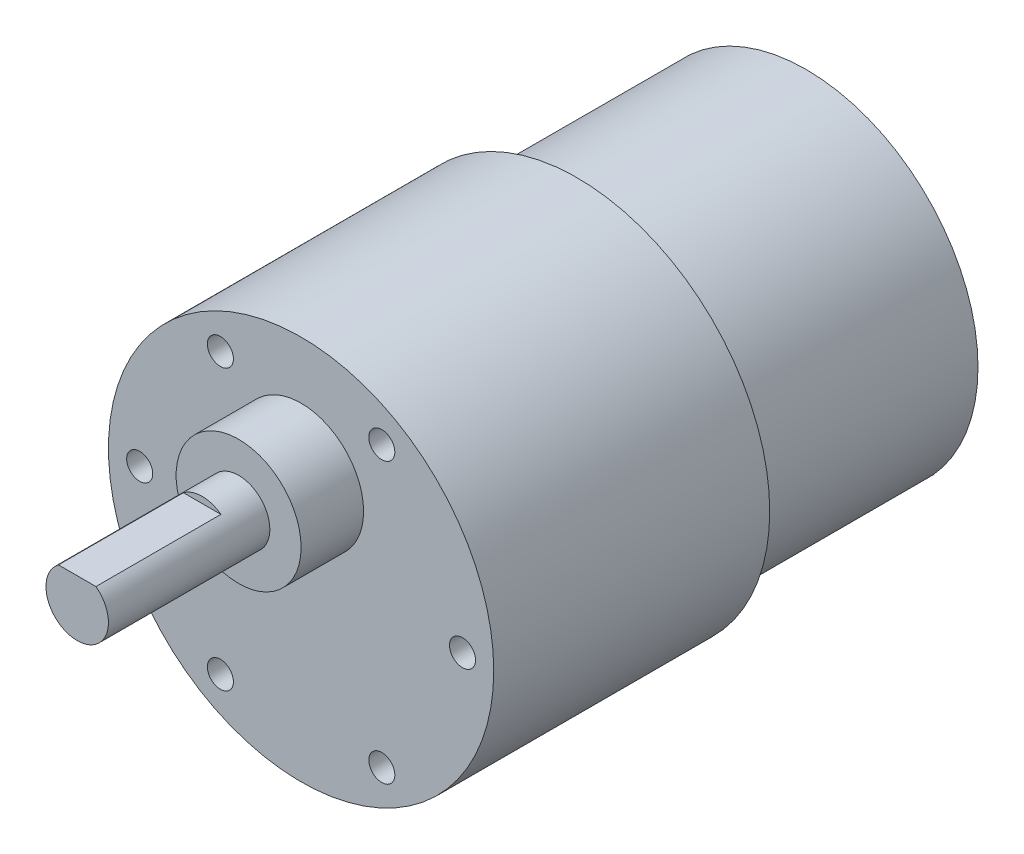
ISO-10303-21;
HEADER;
FILE_DESCRIPTION(('STEP AP214'),'2;1');
FILE_NAME('part.step','',(''),(''),'','','');
FILE_SCHEMA(('AUTOMOTIVE_DESIGN { 1 0 10303 214 1 1 1 1 }'));
ENDSEC;
DATA;
#1=APPLICATION_CONTEXT('core data for automotive mechanical design processes');
#2=APPLICATION_PROTOCOL_DEFINITION('international standard','automotive_design',2000,#1);
#3=PRODUCT_CONTEXT('',#1,'mechanical');
#4=PRODUCT('Part','Part','',(#3));
#5=PRODUCT_RELATED_PRODUCT_CATEGORY('part','',(#4));
#6=PRODUCT_DEFINITION_FORMATION('','',#4);
#7=PRODUCT_DEFINITION_CONTEXT('part definition',#1,'design');
#8=PRODUCT_DEFINITION('design','',#6,#7);
#9=PRODUCT_DEFINITION_SHAPE('','',#8);
#10=(LENGTH_UNIT() NAMED_UNIT(*) SI_UNIT(.MILLI.,.METRE.));
#11=(NAMED_UNIT(*) PLANE_ANGLE_UNIT() SI_UNIT($,.RADIAN.));
#12=(NAMED_UNIT(*) SI_UNIT($,.STERADIAN.) SOLID_ANGLE_UNIT());
#13=UNCERTAINTY_MEASURE_WITH_UNIT(LENGTH_MEASURE(1.E-05),#10,'distance_accuracy_value','');
#14=(GEOMETRIC_REPRESENTATION_CONTEXT(3) GLOBAL_UNCERTAINTY_ASSIGNED_CONTEXT((#13)) GLOBAL_UNIT_ASSIGNED_CONTEXT((#10,
#11,#12)) REPRESENTATION_CONTEXT('',''));
#15=CARTESIAN_POINT('',(0.,0.,0.));
#16=DIRECTION('',(0.,0.,1.));
#17=DIRECTION('',(1.,0.,0.));
#18=AXIS2_PLACEMENT_3D('',#15,#16,#17);
#19=CARTESIAN_POINT('',(0.,0.,-24.5));
#20=DIRECTION('',(0.,0.,-1.));
#21=DIRECTION('',(-1.,0.,0.));
#22=AXIS2_PLACEMENT_3D('',#19,#20,#21);
#23=PLANE('',#22);
#24=CARTESIAN_POINT('',(0.,0.,-24.5));
#25=DIRECTION('',(0.,0.,-1.));
#26=DIRECTION('',(-1.,0.,0.));
#27=AXIS2_PLACEMENT_3D('',#24,#25,#26);
#28=CIRCLE('',#27,8.);
#29=CARTESIAN_POINT('',(-8.,0.,-24.5));
#30=VERTEX_POINT('',#29);
#31=EDGE_CURVE('E454',#30,#30,#28,.T.);
#32=ORIENTED_EDGE('',*,*,#31,.T.);
#33=EDGE_LOOP('',(#32));
#34=FACE_BOUND('',#33,.T.);
#35=CARTESIAN_POINT('',(0.,0.,-24.5));
#36=DIRECTION('',(0.,0.,-1.));
#37=DIRECTION('',(-1.,0.,0.));
#38=AXIS2_PLACEMENT_3D('',#35,#36,#37);
#39=CIRCLE('',#38,9.65740322758762);
#40=CARTESIAN_POINT('',(-9.65740322758762,0.,-24.5));
#41=VERTEX_POINT('',#40);
#42=EDGE_CURVE('E453',#41,#41,#39,.T.);
#43=ORIENTED_EDGE('',*,*,#42,.F.);
#44=EDGE_LOOP('',(#43));
#45=FACE_BOUND('',#44,.T.);
#46=ADVANCED_FACE('F41',(#34,#45),#23,.F.);
#47=CARTESIAN_POINT('',(0.,0.,26.5));
#48=DIRECTION('',(0.,0.,-1.));
#49=DIRECTION('',(-1.,0.,0.));
#50=AXIS2_PLACEMENT_3D('',#47,#48,#49);
#51=CYLINDRICAL_SURFACE('',#50,18.5);
#52=CARTESIAN_POINT('',(0.,0.,26.5));
#53=DIRECTION('',(0.,0.,1.));
#54=DIRECTION('',(1.,0.,0.));
#55=AXIS2_PLACEMENT_3D('',#52,#53,#54);
#56=CIRCLE('',#55,18.5);
#57=CARTESIAN_POINT('',(18.5,0.,26.5));
#58=VERTEX_POINT('',#57);
#59=EDGE_CURVE('E153',#58,#58,#56,.T.);
#60=ORIENTED_EDGE('',*,*,#59,.F.);
#61=EDGE_LOOP('',(#60));
#62=FACE_BOUND('',#61,.T.);
#63=CARTESIAN_POINT('',(0.,0.,0.));
#64=DIRECTION('',(0.,0.,1.));
#65=DIRECTION('',(1.,0.,0.));
#66=AXIS2_PLACEMENT_3D('',#63,#64,#65);
#67=CIRCLE('',#66,18.5);
#68=CARTESIAN_POINT('',(18.5,0.,0.));
#69=VERTEX_POINT('',#68);
#70=EDGE_CURVE('E150',#69,#69,#67,.T.);
#71=ORIENTED_EDGE('',*,*,#70,.T.);
#72=EDGE_LOOP('',(#71));
#73=FACE_BOUND('',#72,.T.);
#74=ADVANCED_FACE('F43',(#62,#73),#51,.T.);
#75=CARTESIAN_POINT('',(0.,0.,26.5));
#76=DIRECTION('',(0.,0.,1.));
#77=DIRECTION('',(1.,0.,0.));
#78=AXIS2_PLACEMENT_3D('',#75,#76,#77);
#79=PLANE('',#78);
#80=CARTESIAN_POINT('',(-7.75000000000002,13.4233937586588,26.5));
#81=DIRECTION('',(0.,0.,1.));
#82=DIRECTION('',(1.,0.,0.));
#83=AXIS2_PLACEMENT_3D('',#80,#81,#82);
#84=CIRCLE('',#83,1.25);
#85=CARTESIAN_POINT('',(-6.50000000000002,13.4233937586588,26.5));
#86=VERTEX_POINT('',#85);
#87=EDGE_CURVE('E97',#86,#86,#84,.T.);
#88=ORIENTED_EDGE('',*,*,#87,.F.);
#89=EDGE_LOOP('',(#88));
#90=FACE_BOUND('',#89,.T.);
#91=CARTESIAN_POINT('',(7.74999999999998,13.4233937586599,26.5));
#92=DIRECTION('',(0.,0.,1.));
#93=DIRECTION('',(1.,0.,0.));
#94=AXIS2_PLACEMENT_3D('',#91,#92,#93);
#95=CIRCLE('',#94,1.25);
#96=CARTESIAN_POINT('',(8.99999999999998,13.4233937586599,26.5));
#97=VERTEX_POINT('',#96);
#98=EDGE_CURVE('E96',#97,#97,#95,.T.);
#99=ORIENTED_EDGE('',*,*,#98,.F.);
#100=EDGE_LOOP('',(#99));
#101=FACE_BOUND('',#100,.T.);
#102=CARTESIAN_POINT('',(15.500000000001,1.66495789927257E-12,26.5));
#103=DIRECTION('',(0.,0.,1.));
#104=DIRECTION('',(1.,0.,0.));
#105=AXIS2_PLACEMENT_3D('',#102,#103,#104);
#106=CIRCLE('',#105,1.25);
#107=CARTESIAN_POINT('',(16.750000000001,1.66495789927257E-12,26.5));
#108=VERTEX_POINT('',#107);
#109=EDGE_CURVE('E109',#108,#108,#106,.T.);
#110=ORIENTED_EDGE('',*,*,#109,.F.);
#111=EDGE_LOOP('',(#110));
#112=FACE_BOUND('',#111,.T.);
#113=CARTESIAN_POINT('',(7.75000000000192,-13.4233937586577,26.5));
#114=DIRECTION('',(0.,0.,1.));
#115=DIRECTION('',(1.,0.,0.));
#116=AXIS2_PLACEMENT_3D('',#113,#114,#115);
#117=CIRCLE('',#116,1.25);
#118=CARTESIAN_POINT('',(9.00000000000192,-13.4233937586577,26.5));
#119=VERTEX_POINT('',#118);
#120=EDGE_CURVE('E115',#119,#119,#117,.T.);
#121=ORIENTED_EDGE('',*,*,#120,.F.);
#122=EDGE_LOOP('',(#121));
#123=FACE_BOUND('',#122,.T.);
#124=CARTESIAN_POINT('',(-7.74999999999808,-13.4233937586588,26.5));
#125=DIRECTION('',(0.,0.,1.));
#126=DIRECTION('',(1.,0.,0.));
#127=AXIS2_PLACEMENT_3D('',#124,#125,#126);
#128=CIRCLE('',#127,1.25);
#129=CARTESIAN_POINT('',(-6.49999999999808,-13.4233937586588,26.5));
#130=VERTEX_POINT('',#129);
#131=EDGE_CURVE('E121',#130,#130,#128,.T.);
#132=ORIENTED_EDGE('',*,*,#131,.F.);
#133=EDGE_LOOP('',(#132));
#134=FACE_BOUND('',#133,.T.);
#135=CARTESIAN_POINT('',(-15.4999999999991,-5.84225173739024E-13,26.5));
#136=DIRECTION('',(0.,0.,1.));
#137=DIRECTION('',(1.,0.,0.));
#138=AXIS2_PLACEMENT_3D('',#135,#136,#137);
#139=CIRCLE('',#138,1.25);
#140=CARTESIAN_POINT('',(-14.2499999999991,-5.84225173739024E-13,26.5));
#141=VERTEX_POINT('',#140);
#142=EDGE_CURVE('E127',#141,#141,#139,.T.);
#143=ORIENTED_EDGE('',*,*,#142,.F.);
#144=EDGE_LOOP('',(#143));
#145=FACE_BOUND('',#144,.T.);
#146=CARTESIAN_POINT('',(0.,7.,26.5));
#147=DIRECTION('',(0.,0.,1.));
#148=DIRECTION('',(1.,0.,0.));
#149=AXIS2_PLACEMENT_3D('',#146,#147,#148);
#150=CIRCLE('',#149,6.);
#151=CARTESIAN_POINT('',(6.,7.,26.5));
#152=VERTEX_POINT('',#151);
#153=EDGE_CURVE('E144',#152,#152,#150,.T.);
#154=ORIENTED_EDGE('',*,*,#153,.F.);
#155=EDGE_LOOP('',(#154));
#156=FACE_BOUND('',#155,.T.);
#157=ORIENTED_EDGE('',*,*,#59,.T.);
#158=EDGE_LOOP('',(#157));
#159=FACE_BOUND('',#158,.T.);
#160=ADVANCED_FACE('F187',(#90,#101,#112,#123,#134,#145,#156,#159),#79,.T.);
#161=CARTESIAN_POINT('',(0.,0.,0.));
#162=DIRECTION('',(0.,0.,1.));
#163=DIRECTION('',(1.,0.,0.));
#164=AXIS2_PLACEMENT_3D('',#161,#162,#163);
#165=PLANE('',#164);
#166=CARTESIAN_POINT('',(0.,0.,0.));
#167=DIRECTION('',(0.,0.,1.));
#168=DIRECTION('',(1.,0.,0.));
#169=AXIS2_PLACEMENT_3D('',#166,#167,#168);
#170=CIRCLE('',#169,16.5);
#171=CARTESIAN_POINT('',(16.5,0.,0.));
#172=VERTEX_POINT('',#171);
#173=EDGE_CURVE('E11',#172,#172,#170,.F.);
#174=ORIENTED_EDGE('',*,*,#173,.F.);
#175=EDGE_LOOP('',(#174));
#176=FACE_BOUND('',#175,.T.);
#177=ORIENTED_EDGE('',*,*,#70,.F.);
#178=EDGE_LOOP('',(#177));
#179=FACE_BOUND('',#178,.T.);
#180=ADVANCED_FACE('F283',(#176,#179),#165,.F.);
#181=CARTESIAN_POINT('',(0.,7.,32.5));
#182=DIRECTION('',(0.,0.,-1.));
#183=DIRECTION('',(-1.,0.,0.));
#184=AXIS2_PLACEMENT_3D('',#181,#182,#183);
#185=CYLINDRICAL_SURFACE('',#184,6.);
#186=CARTESIAN_POINT('',(0.,7.,32.5));
#187=DIRECTION('',(0.,0.,1.));
#188=DIRECTION('',(1.,0.,0.));
#189=AXIS2_PLACEMENT_3D('',#186,#187,#188);
#190=CIRCLE('',#189,6.);
#191=CARTESIAN_POINT('',(6.,7.,32.5));
#192=VERTEX_POINT('',#191);
#193=EDGE_CURVE('E147',#192,#192,#190,.T.);
#194=ORIENTED_EDGE('',*,*,#193,.F.);
#195=EDGE_LOOP('',(#194));
#196=FACE_BOUND('',#195,.T.);
#197=ORIENTED_EDGE('',*,*,#153,.T.);
#198=EDGE_LOOP('',(#197));
#199=FACE_BOUND('',#198,.T.);
#200=ADVANCED_FACE('F273',(#196,#199),#185,.T.);
#201=CARTESIAN_POINT('',(0.,7.,32.5));
#202=DIRECTION('',(0.,0.,1.));
#203=DIRECTION('',(1.,0.,0.));
#204=AXIS2_PLACEMENT_3D('',#201,#202,#203);
#205=PLANE('',#204);
#206=CARTESIAN_POINT('',(0.,7.,32.5));
#207=DIRECTION('',(0.,0.,1.));
#208=DIRECTION('',(1.,0.,0.));
#209=AXIS2_PLACEMENT_3D('',#206,#207,#208);
#210=CIRCLE('',#209,3.);
#211=CARTESIAN_POINT('',(3.,7.,32.5));
#212=VERTEX_POINT('',#211);
#213=EDGE_CURVE('E140',#212,#212,#210,.T.);
#214=ORIENTED_EDGE('',*,*,#213,.F.);
#215=EDGE_LOOP('',(#214));
#216=FACE_BOUND('',#215,.T.);
#217=ORIENTED_EDGE('',*,*,#193,.T.);
#218=EDGE_LOOP('',(#217));
#219=FACE_BOUND('',#218,.T.);
#220=ADVANCED_FACE('F176',(#216,#219),#205,.T.);
#221=CARTESIAN_POINT('',(0.,7.,48.));
#222=DIRECTION('',(0.,0.,-1.));
#223=DIRECTION('',(-1.,0.,0.));
#224=AXIS2_PLACEMENT_3D('',#221,#222,#223);
#225=CYLINDRICAL_SURFACE('',#224,3.);
#226=CARTESIAN_POINT('',(0.,7.,48.));
#227=DIRECTION('',(0.,0.,1.));
#228=DIRECTION('',(1.,0.,0.));
#229=AXIS2_PLACEMENT_3D('',#226,#227,#228);
#230=CIRCLE('',#229,3.);
#231=CARTESIAN_POINT('',(-1.8,9.4,48.));
#232=VERTEX_POINT('',#231);
#233=CARTESIAN_POINT('',(1.8,9.4,48.));
#234=VERTEX_POINT('',#233);
#235=EDGE_CURVE('E141',#232,#234,#230,.T.);
#236=ORIENTED_EDGE('',*,*,#235,.F.);
#237=DIRECTION('',(0.,0.,-1.));
#238=VECTOR('',#237,1.);
#239=CARTESIAN_POINT('',(-1.8,9.4,48.));
#240=LINE('',#239,#238);
#241=CARTESIAN_POINT('',(-1.8,9.4,36.));
#242=VERTEX_POINT('',#241);
#243=EDGE_CURVE('E56',#232,#242,#240,.T.);
#244=ORIENTED_EDGE('',*,*,#243,.T.);
#245=CARTESIAN_POINT('',(0.,7.,36.));
#246=DIRECTION('',(0.,0.,1.));
#247=DIRECTION('',(1.,0.,0.));
#248=AXIS2_PLACEMENT_3D('',#245,#246,#247);
#249=CIRCLE('',#248,3.);
#250=CARTESIAN_POINT('',(1.8,9.4,36.));
#251=VERTEX_POINT('',#250);
#252=EDGE_CURVE('E49',#251,#242,#249,.T.);
#253=ORIENTED_EDGE('',*,*,#252,.F.);
#254=DIRECTION('',(0.,0.,-1.));
#255=VECTOR('',#254,1.);
#256=CARTESIAN_POINT('',(1.8,9.4,48.));
#257=LINE('',#256,#255);
#258=EDGE_CURVE('E61',#251,#234,#257,.F.);
#259=ORIENTED_EDGE('',*,*,#258,.T.);
#260=EDGE_LOOP('',(#236,#244,#253,#259));
#261=FACE_BOUND('',#260,.T.);
#262=ORIENTED_EDGE('',*,*,#213,.T.);
#263=EDGE_LOOP('',(#262));
#264=FACE_BOUND('',#263,.T.);
#265=ADVANCED_FACE('F165',(#261,#264),#225,.T.);
#266=CARTESIAN_POINT('',(0.,7.,48.));
#267=DIRECTION('',(0.,0.,1.));
#268=DIRECTION('',(1.,0.,0.));
#269=AXIS2_PLACEMENT_3D('',#266,#267,#268);
#270=PLANE('',#269);
#271=DIRECTION('',(1.,0.,0.));
#272=VECTOR('',#271,1.);
#273=CARTESIAN_POINT('',(0.,9.4,48.));
#274=LINE('',#273,#272);
#275=EDGE_CURVE('E156',#232,#234,#274,.T.);
#276=ORIENTED_EDGE('',*,*,#275,.F.);
#277=ORIENTED_EDGE('',*,*,#235,.T.);
#278=EDGE_LOOP('',(#276,#277));
#279=FACE_BOUND('',#278,.T.);
#280=ADVANCED_FACE('F168',(#279),#270,.T.);
#281=CARTESIAN_POINT('',(0.,0.,36.));
#282=DIRECTION('',(0.,0.,1.));
#283=DIRECTION('',(1.,0.,0.));
#284=AXIS2_PLACEMENT_3D('',#281,#282,#283);
#285=PLANE('',#284);
#286=ORIENTED_EDGE('',*,*,#252,.T.);
#287=DIRECTION('',(1.,0.,0.));
#288=VECTOR('',#287,1.);
#289=CARTESIAN_POINT('',(-2.92302524229966,9.4,36.));
#290=LINE('',#289,#288);
#291=EDGE_CURVE('E136',#242,#251,#290,.T.);
#292=ORIENTED_EDGE('',*,*,#291,.T.);
#293=EDGE_LOOP('',(#286,#292));
#294=FACE_BOUND('',#293,.T.);
#295=ADVANCED_FACE('F161',(#294),#285,.T.);
#296=CARTESIAN_POINT('',(-2.92302524229966,9.4,36.));
#297=DIRECTION('',(0.,-1.,0.));
#298=DIRECTION('',(0.,0.,-1.));
#299=AXIS2_PLACEMENT_3D('',#296,#297,#298);
#300=PLANE('',#299);
#301=ORIENTED_EDGE('',*,*,#275,.T.);
#302=ORIENTED_EDGE('',*,*,#258,.F.);
#303=ORIENTED_EDGE('',*,*,#291,.F.);
#304=ORIENTED_EDGE('',*,*,#243,.F.);
#305=EDGE_LOOP('',(#301,#302,#303,#304));
#306=FACE_BOUND('',#305,.T.);
#307=ADVANCED_FACE('F163',(#306),#300,.F.);
#308=CARTESIAN_POINT('',(0.,0.,-22.));
#309=DIRECTION('',(0.,0.,1.));
#310=DIRECTION('',(1.,0.,0.));
#311=AXIS2_PLACEMENT_3D('',#308,#309,#310);
#312=CYLINDRICAL_SURFACE('',#311,16.5);
#313=CARTESIAN_POINT('',(0.,0.,-22.));
#314=DIRECTION('',(0.,0.,-1.));
#315=DIRECTION('',(-1.,0.,0.));
#316=AXIS2_PLACEMENT_3D('',#313,#314,#315);
#317=CIRCLE('',#316,16.5);
#318=CARTESIAN_POINT('',(-16.5,0.,-22.));
#319=VERTEX_POINT('',#318);
#320=EDGE_CURVE('E133',#319,#319,#317,.T.);
#321=ORIENTED_EDGE('',*,*,#320,.F.);
#322=EDGE_LOOP('',(#321));
#323=FACE_BOUND('',#322,.T.);
#324=ORIENTED_EDGE('',*,*,#173,.T.);
#325=EDGE_LOOP('',(#324));
#326=FACE_BOUND('',#325,.T.);
#327=ADVANCED_FACE('F244',(#323,#326),#312,.T.);
#328=CARTESIAN_POINT('',(0.,0.,-22.));
#329=DIRECTION('',(0.,0.,-1.));
#330=DIRECTION('',(-1.,0.,0.));
#331=AXIS2_PLACEMENT_3D('',#328,#329,#330);
#332=PLANE('',#331);
#333=ORIENTED_EDGE('',*,*,#320,.T.);
#334=EDGE_LOOP('',(#333));
#335=FACE_BOUND('',#334,.T.);
#336=CARTESIAN_POINT('',(0.,0.,-22.));
#337=DIRECTION('',(0.,0.,-1.));
#338=DIRECTION('',(-1.,0.,0.));
#339=AXIS2_PLACEMENT_3D('',#336,#337,#338);
#340=CIRCLE('',#339,8.);
#341=CARTESIAN_POINT('',(-8.,0.,-22.));
#342=VERTEX_POINT('',#341);
#343=EDGE_CURVE('E103',#342,#342,#340,.F.);
#344=ORIENTED_EDGE('',*,*,#343,.T.);
#345=EDGE_LOOP('',(#344));
#346=FACE_BOUND('',#345,.T.);
#347=ADVANCED_FACE('F240',(#335,#346),#332,.T.);
#348=CARTESIAN_POINT('',(-15.4999999999991,-5.84225173739024E-13,19.));
#349=DIRECTION('',(0.,0.,1.));
#350=DIRECTION('',(1.,0.,0.));
#351=AXIS2_PLACEMENT_3D('',#348,#349,#350);
#352=CONICAL_SURFACE('',#351,1.25,1.02974425867665);
#353=CARTESIAN_POINT('',(-15.4999999999991,-5.84225173739024E-13,18.2489242262155));
#354=VERTEX_POINT('',#353);
#355=VERTEX_LOOP('',#354);
#356=FACE_BOUND('',#355,.T.);
#357=CARTESIAN_POINT('',(-15.4999999999991,-5.84225173739024E-13,19.));
#358=DIRECTION('',(0.,0.,1.));
#359=DIRECTION('',(1.,0.,0.));
#360=AXIS2_PLACEMENT_3D('',#357,#358,#359);
#361=CIRCLE('',#360,1.25);
#362=CARTESIAN_POINT('',(-14.2499999999991,-5.84225173739024E-13,19.));
#363=VERTEX_POINT('',#362);
#364=EDGE_CURVE('E130',#363,#363,#361,.T.);
#365=ORIENTED_EDGE('',*,*,#364,.T.);
#366=EDGE_LOOP('',(#365));
#367=FACE_BOUND('',#366,.T.);
#368=ADVANCED_FACE('F236',(#356,#367),#352,.F.);
#369=CARTESIAN_POINT('',(-15.4999999999991,-5.84225173739024E-13,26.5));
#370=DIRECTION('',(0.,0.,1.));
#371=DIRECTION('',(1.,0.,0.));
#372=AXIS2_PLACEMENT_3D('',#369,#370,#371);
#373=CYLINDRICAL_SURFACE('',#372,1.25);
#374=ORIENTED_EDGE('',*,*,#364,.F.);
#375=EDGE_LOOP('',(#374));
#376=FACE_BOUND('',#375,.T.);
#377=ORIENTED_EDGE('',*,*,#142,.T.);
#378=EDGE_LOOP('',(#377));
#379=FACE_BOUND('',#378,.T.);
#380=ADVANCED_FACE('F232',(#376,#379),#373,.F.);
#381=CARTESIAN_POINT('',(-7.74999999999808,-13.4233937586588,19.));
#382=DIRECTION('',(0.,0.,1.));
#383=DIRECTION('',(1.,0.,0.));
#384=AXIS2_PLACEMENT_3D('',#381,#382,#383);
#385=CONICAL_SURFACE('',#384,1.25,1.02974425867665);
#386=CARTESIAN_POINT('',(-7.74999999999808,-13.4233937586588,18.2489242262155));
#387=VERTEX_POINT('',#386);
#388=VERTEX_LOOP('',#387);
#389=FACE_BOUND('',#388,.T.);
#390=CARTESIAN_POINT('',(-7.74999999999808,-13.4233937586588,19.));
#391=DIRECTION('',(0.,0.,1.));
#392=DIRECTION('',(1.,0.,0.));
#393=AXIS2_PLACEMENT_3D('',#390,#391,#392);
#394=CIRCLE('',#393,1.25);
#395=CARTESIAN_POINT('',(-6.49999999999808,-13.4233937586588,19.));
#396=VERTEX_POINT('',#395);
#397=EDGE_CURVE('E124',#396,#396,#394,.T.);
#398=ORIENTED_EDGE('',*,*,#397,.T.);
#399=EDGE_LOOP('',(#398));
#400=FACE_BOUND('',#399,.T.);
#401=ADVANCED_FACE('F228',(#389,#400),#385,.F.);
#402=CARTESIAN_POINT('',(-7.74999999999808,-13.4233937586588,26.5));
#403=DIRECTION('',(0.,0.,1.));
#404=DIRECTION('',(1.,0.,0.));
#405=AXIS2_PLACEMENT_3D('',#402,#403,#404);
#406=CYLINDRICAL_SURFACE('',#405,1.25);
#407=ORIENTED_EDGE('',*,*,#397,.F.);
#408=EDGE_LOOP('',(#407));
#409=FACE_BOUND('',#408,.T.);
#410=ORIENTED_EDGE('',*,*,#131,.T.);
#411=EDGE_LOOP('',(#410));
#412=FACE_BOUND('',#411,.T.);
#413=ADVANCED_FACE('F224',(#409,#412),#406,.F.);
#414=CARTESIAN_POINT('',(7.75000000000192,-13.4233937586577,19.));
#415=DIRECTION('',(0.,0.,1.));
#416=DIRECTION('',(1.,0.,0.));
#417=AXIS2_PLACEMENT_3D('',#414,#415,#416);
#418=CONICAL_SURFACE('',#417,1.25,1.02974425867665);
#419=CARTESIAN_POINT('',(7.75000000000192,-13.4233937586577,18.2489242262155));
#420=VERTEX_POINT('',#419);
#421=VERTEX_LOOP('',#420);
#422=FACE_BOUND('',#421,.T.);
#423=CARTESIAN_POINT('',(7.75000000000192,-13.4233937586577,19.));
#424=DIRECTION('',(0.,0.,1.));
#425=DIRECTION('',(1.,0.,0.));
#426=AXIS2_PLACEMENT_3D('',#423,#424,#425);
#427=CIRCLE('',#426,1.25);
#428=CARTESIAN_POINT('',(9.00000000000192,-13.4233937586577,19.));
#429=VERTEX_POINT('',#428);
#430=EDGE_CURVE('E118',#429,#429,#427,.T.);
#431=ORIENTED_EDGE('',*,*,#430,.T.);
#432=EDGE_LOOP('',(#431));
#433=FACE_BOUND('',#432,.T.);
#434=ADVANCED_FACE('F220',(#422,#433),#418,.F.);
#435=CARTESIAN_POINT('',(7.75000000000192,-13.4233937586577,26.5));
#436=DIRECTION('',(0.,0.,1.));
#437=DIRECTION('',(1.,0.,0.));
#438=AXIS2_PLACEMENT_3D('',#435,#436,#437);
#439=CYLINDRICAL_SURFACE('',#438,1.25);
#440=ORIENTED_EDGE('',*,*,#430,.F.);
#441=EDGE_LOOP('',(#440));
#442=FACE_BOUND('',#441,.T.);
#443=ORIENTED_EDGE('',*,*,#120,.T.);
#444=EDGE_LOOP('',(#443));
#445=FACE_BOUND('',#444,.T.);
#446=ADVANCED_FACE('F216',(#442,#445),#439,.F.);
#447=CARTESIAN_POINT('',(15.500000000001,1.66495789927257E-12,19.));
#448=DIRECTION('',(0.,0.,1.));
#449=DIRECTION('',(1.,0.,0.));
#450=AXIS2_PLACEMENT_3D('',#447,#448,#449);
#451=CONICAL_SURFACE('',#450,1.25,1.02974425867665);
#452=CARTESIAN_POINT('',(15.500000000001,1.66495789927257E-12,18.2489242262155));
#453=VERTEX_POINT('',#452);
#454=VERTEX_LOOP('',#453);
#455=FACE_BOUND('',#454,.T.);
#456=CARTESIAN_POINT('',(15.500000000001,1.66495789927257E-12,19.));
#457=DIRECTION('',(0.,0.,1.));
#458=DIRECTION('',(1.,0.,0.));
#459=AXIS2_PLACEMENT_3D('',#456,#457,#458);
#460=CIRCLE('',#459,1.25);
#461=CARTESIAN_POINT('',(16.750000000001,1.66495789927257E-12,19.));
#462=VERTEX_POINT('',#461);
#463=EDGE_CURVE('E112',#462,#462,#460,.T.);
#464=ORIENTED_EDGE('',*,*,#463,.T.);
#465=EDGE_LOOP('',(#464));
#466=FACE_BOUND('',#465,.T.);
#467=ADVANCED_FACE('F212',(#455,#466),#451,.F.);
#468=CARTESIAN_POINT('',(15.500000000001,1.66495789927257E-12,26.5));
#469=DIRECTION('',(0.,0.,1.));
#470=DIRECTION('',(1.,0.,0.));
#471=AXIS2_PLACEMENT_3D('',#468,#469,#470);
#472=CYLINDRICAL_SURFACE('',#471,1.25);
#473=ORIENTED_EDGE('',*,*,#463,.F.);
#474=EDGE_LOOP('',(#473));
#475=FACE_BOUND('',#474,.T.);
#476=ORIENTED_EDGE('',*,*,#109,.T.);
#477=EDGE_LOOP('',(#476));
#478=FACE_BOUND('',#477,.T.);
#479=ADVANCED_FACE('F208',(#475,#478),#472,.F.);
#480=CARTESIAN_POINT('',(7.74999999999998,13.4233937586599,19.));
#481=DIRECTION('',(0.,0.,1.));
#482=DIRECTION('',(1.,0.,0.));
#483=AXIS2_PLACEMENT_3D('',#480,#481,#482);
#484=CONICAL_SURFACE('',#483,1.25,1.02974425867665);
#485=CARTESIAN_POINT('',(7.74999999999998,13.4233937586599,18.2489242262155));
#486=VERTEX_POINT('',#485);
#487=VERTEX_LOOP('',#486);
#488=FACE_BOUND('',#487,.T.);
#489=CARTESIAN_POINT('',(7.74999999999998,13.4233937586599,19.));
#490=DIRECTION('',(0.,0.,1.));
#491=DIRECTION('',(1.,0.,0.));
#492=AXIS2_PLACEMENT_3D('',#489,#490,#491);
#493=CIRCLE('',#492,1.25);
#494=CARTESIAN_POINT('',(8.99999999999998,13.4233937586599,19.));
#495=VERTEX_POINT('',#494);
#496=EDGE_CURVE('E100',#495,#495,#493,.T.);
#497=ORIENTED_EDGE('',*,*,#496,.T.);
#498=EDGE_LOOP('',(#497));
#499=FACE_BOUND('',#498,.T.);
#500=ADVANCED_FACE('F204',(#488,#499),#484,.F.);
#501=CARTESIAN_POINT('',(7.74999999999998,13.4233937586599,26.5));
#502=DIRECTION('',(0.,0.,1.));
#503=DIRECTION('',(1.,0.,0.));
#504=AXIS2_PLACEMENT_3D('',#501,#502,#503);
#505=CYLINDRICAL_SURFACE('',#504,1.25);
#506=ORIENTED_EDGE('',*,*,#496,.F.);
#507=EDGE_LOOP('',(#506));
#508=FACE_BOUND('',#507,.T.);
#509=ORIENTED_EDGE('',*,*,#98,.T.);
#510=EDGE_LOOP('',(#509));
#511=FACE_BOUND('',#510,.T.);
#512=ADVANCED_FACE('F90',(#508,#511),#505,.F.);
#513=CARTESIAN_POINT('',(-7.75000000000002,13.4233937586588,19.));
#514=DIRECTION('',(0.,0.,1.));
#515=DIRECTION('',(1.,0.,0.));
#516=AXIS2_PLACEMENT_3D('',#513,#514,#515);
#517=CONICAL_SURFACE('',#516,1.25,1.02974425867665);
#518=CARTESIAN_POINT('',(-7.75000000000002,13.4233937586588,18.2489242262155));
#519=VERTEX_POINT('',#518);
#520=VERTEX_LOOP('',#519);
#521=FACE_BOUND('',#520,.T.);
#522=CARTESIAN_POINT('',(-7.75000000000002,13.4233937586588,19.));
#523=DIRECTION('',(0.,0.,1.));
#524=DIRECTION('',(1.,0.,0.));
#525=AXIS2_PLACEMENT_3D('',#522,#523,#524);
#526=CIRCLE('',#525,1.25);
#527=CARTESIAN_POINT('',(-6.50000000000002,13.4233937586588,19.));
#528=VERTEX_POINT('',#527);
#529=EDGE_CURVE('E94',#528,#528,#526,.T.);
#530=ORIENTED_EDGE('',*,*,#529,.T.);
#531=EDGE_LOOP('',(#530));
#532=FACE_BOUND('',#531,.T.);
#533=ADVANCED_FACE('F86',(#521,#532),#517,.F.);
#534=CARTESIAN_POINT('',(-7.75000000000002,13.4233937586588,26.5));
#535=DIRECTION('',(0.,0.,1.));
#536=DIRECTION('',(1.,0.,0.));
#537=AXIS2_PLACEMENT_3D('',#534,#535,#536);
#538=CYLINDRICAL_SURFACE('',#537,1.25);
#539=ORIENTED_EDGE('',*,*,#529,.F.);
#540=EDGE_LOOP('',(#539));
#541=FACE_BOUND('',#540,.T.);
#542=ORIENTED_EDGE('',*,*,#87,.T.);
#543=EDGE_LOOP('',(#542));
#544=FACE_BOUND('',#543,.T.);
#545=ADVANCED_FACE('F89',(#541,#544),#538,.F.);
#546=CARTESIAN_POINT('',(0.,0.,17.5979797464467));
#547=DIRECTION('',(0.,0.,-1.));
#548=DIRECTION('',(-1.,0.,0.));
#549=AXIS2_PLACEMENT_3D('',#546,#547,#548);
#550=CYLINDRICAL_SURFACE('',#549,8.);
#551=ORIENTED_EDGE('',*,*,#343,.F.);
#552=EDGE_LOOP('',(#551));
#553=FACE_BOUND('',#552,.T.);
#554=ORIENTED_EDGE('',*,*,#31,.F.);
#555=EDGE_LOOP('',(#554));
#556=FACE_BOUND('',#555,.T.);
#557=ADVANCED_FACE('F193',(#553,#556),#550,.T.);
#558=CARTESIAN_POINT('',(0.,0.,-23.5));
#559=DIRECTION('',(0.,0.,-1.));
#560=DIRECTION('',(-1.,0.,0.));
#561=AXIS2_PLACEMENT_3D('',#558,#559,#560);
#562=CYLINDRICAL_SURFACE('',#561,9.65740322758762);
#563=CARTESIAN_POINT('',(0.,0.,-26.5));
#564=DIRECTION('',(0.,0.,-1.));
#565=DIRECTION('',(-1.,0.,0.));
#566=AXIS2_PLACEMENT_3D('',#563,#564,#565);
#567=CIRCLE('',#566,9.65740322758762);
#568=CARTESIAN_POINT('',(-9.65740322758762,0.,-26.5));
#569=VERTEX_POINT('',#568);
#570=EDGE_CURVE('E450',#569,#569,#567,.T.);
#571=ORIENTED_EDGE('',*,*,#570,.F.);
#572=EDGE_LOOP('',(#571));
#573=FACE_BOUND('',#572,.T.);
#574=ORIENTED_EDGE('',*,*,#42,.T.);
#575=EDGE_LOOP('',(#574));
#576=FACE_BOUND('',#575,.T.);
#577=ADVANCED_FACE('F198',(#573,#576),#562,.T.);
#578=CARTESIAN_POINT('',(0.,0.,-26.5));
#579=DIRECTION('',(0.,0.,-1.));
#580=DIRECTION('',(-1.,0.,0.));
#581=AXIS2_PLACEMENT_3D('',#578,#579,#580);
#582=PLANE('',#581);
#583=ORIENTED_EDGE('',*,*,#570,.T.);
#584=EDGE_LOOP('',(#583));
#585=FACE_BOUND('',#584,.T.);
#586=ADVANCED_FACE('F195',(#585),#582,.T.);
#587=CLOSED_SHELL('',(#46,#74,#160,#180,#200,#220,#265,#280,#295,#307,#327,#347,#368,#380,#401,
#413,#434,#446,#467,#479,#500,#512,#533,#545,#557,#577,#586));
#588=MANIFOLD_SOLID_BREP('B2',#587);
#589=ADVANCED_BREP_SHAPE_REPRESENTATION('',(#18,#588),#14);
#590=SHAPE_DEFINITION_REPRESENTATION(#9,#589);
ENDSEC;
END-ISO-10303-21;
